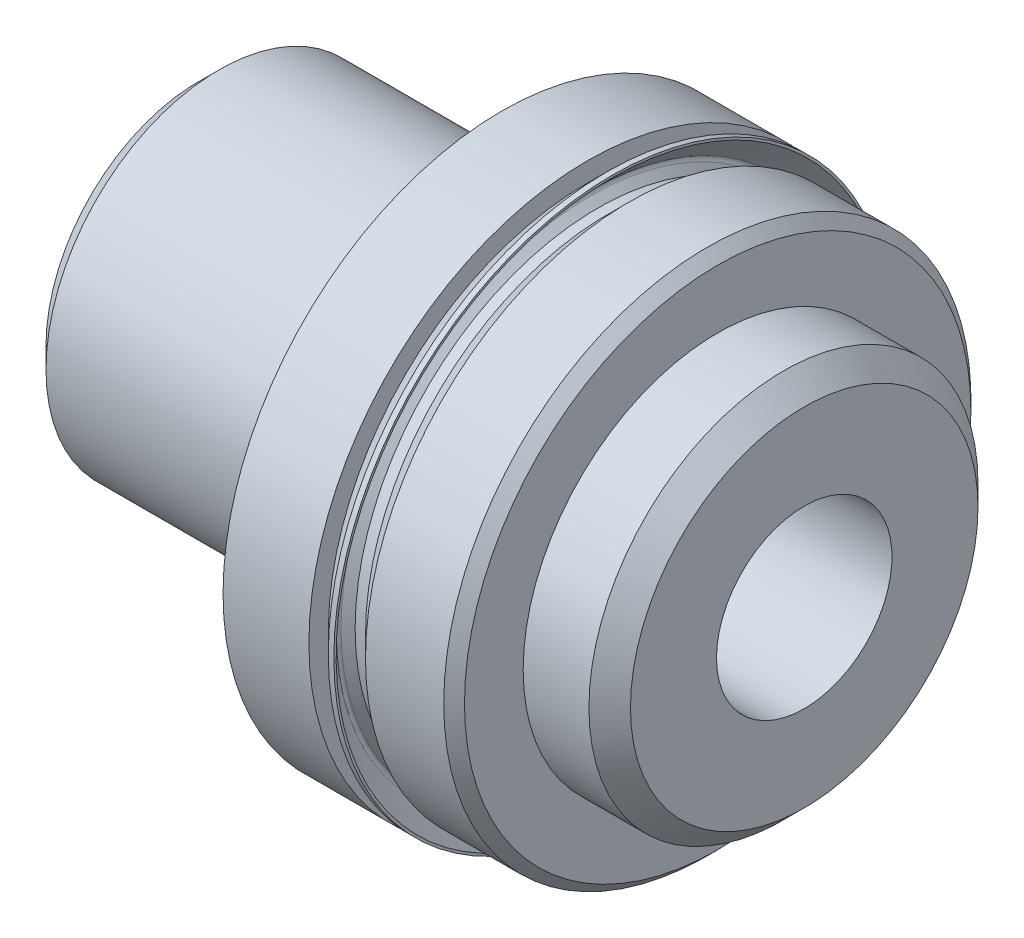
ISO-10303-21;
HEADER;
FILE_DESCRIPTION(('STEP AP214'),'2;1');
FILE_NAME('part.step','',(''),(''),'','','');
FILE_SCHEMA(('AUTOMOTIVE_DESIGN { 1 0 10303 214 1 1 1 1 }'));
ENDSEC;
DATA;
#1=APPLICATION_CONTEXT('core data for automotive mechanical design processes');
#2=APPLICATION_PROTOCOL_DEFINITION('international standard','automotive_design',2000,#1);
#3=PRODUCT_CONTEXT('',#1,'mechanical');
#4=PRODUCT('Part','Part','',(#3));
#5=PRODUCT_RELATED_PRODUCT_CATEGORY('part','',(#4));
#6=PRODUCT_DEFINITION_FORMATION('','',#4);
#7=PRODUCT_DEFINITION_CONTEXT('part definition',#1,'design');
#8=PRODUCT_DEFINITION('design','',#6,#7);
#9=PRODUCT_DEFINITION_SHAPE('','',#8);
#10=(LENGTH_UNIT() NAMED_UNIT(*) SI_UNIT(.MILLI.,.METRE.));
#11=(NAMED_UNIT(*) PLANE_ANGLE_UNIT() SI_UNIT($,.RADIAN.));
#12=(NAMED_UNIT(*) SI_UNIT($,.STERADIAN.) SOLID_ANGLE_UNIT());
#13=UNCERTAINTY_MEASURE_WITH_UNIT(LENGTH_MEASURE(1.E-05),#10,'distance_accuracy_value','');
#14=(GEOMETRIC_REPRESENTATION_CONTEXT(3) GLOBAL_UNCERTAINTY_ASSIGNED_CONTEXT((#13)) GLOBAL_UNIT_ASSIGNED_CONTEXT((#10,
#11,#12)) REPRESENTATION_CONTEXT('',''));
#15=CARTESIAN_POINT('',(0.,0.,0.));
#16=DIRECTION('',(0.,0.,1.));
#17=DIRECTION('',(1.,0.,0.));
#18=AXIS2_PLACEMENT_3D('',#15,#16,#17);
#19=CARTESIAN_POINT('',(15.1894510695975,0.,0.));
#20=DIRECTION('',(1.,0.,0.));
#21=DIRECTION('',(0.,1.,0.));
#22=AXIS2_PLACEMENT_3D('',#19,#20,#21);
#23=CONICAL_SURFACE('',#22,10.1393318041258,0.785398163397446);
#24=CARTESIAN_POINT('',(14.3972871939465,0.,0.));
#25=DIRECTION('',(1.,0.,0.));
#26=DIRECTION('',(0.,0.,-1.));
#27=AXIS2_PLACEMENT_3D('',#24,#25,#26);
#28=CIRCLE('',#27,9.34716792847483);
#29=CARTESIAN_POINT('',(14.3972871939465,0.,-9.34716792847483));
#30=VERTEX_POINT('',#29);
#31=EDGE_CURVE('E80',#30,#30,#28,.F.);
#32=ORIENTED_EDGE('',*,*,#31,.T.);
#33=EDGE_LOOP('',(#32));
#34=FACE_BOUND('',#33,.T.);
#35=CARTESIAN_POINT('',(15.1894510695975,0.,0.));
#36=DIRECTION('',(1.,0.,0.));
#37=DIRECTION('',(0.,1.,0.));
#38=AXIS2_PLACEMENT_3D('',#35,#36,#37);
#39=CIRCLE('',#38,10.1393318041258);
#40=CARTESIAN_POINT('',(15.1894510695975,10.1393318041258,0.));
#41=VERTEX_POINT('',#40);
#42=EDGE_CURVE('E18',#41,#41,#39,.F.);
#43=ORIENTED_EDGE('',*,*,#42,.F.);
#44=EDGE_LOOP('',(#43));
#45=FACE_BOUND('',#44,.T.);
#46=ADVANCED_FACE('F15',(#34,#45),#23,.F.);
#47=CARTESIAN_POINT('',(14.4870897551572,0.,0.));
#48=DIRECTION('',(1.,0.,0.));
#49=DIRECTION('',(0.,0.,-1.));
#50=AXIS2_PLACEMENT_3D('',#47,#48,#49);
#51=TOROIDAL_SURFACE('',#50,9.25736536726414,0.126999999999995);
#52=ORIENTED_EDGE('',*,*,#31,.F.);
#53=EDGE_LOOP('',(#52));
#54=FACE_BOUND('',#53,.T.);
#55=CARTESIAN_POINT('',(14.3972871939465,0.,0.));
#56=DIRECTION('',(-1.,0.,0.));
#57=DIRECTION('',(0.,0.,1.));
#58=AXIS2_PLACEMENT_3D('',#55,#56,#57);
#59=CIRCLE('',#58,9.16756280605345);
#60=CARTESIAN_POINT('',(14.3972871939465,0.,9.16756280605345));
#61=VERTEX_POINT('',#60);
#62=EDGE_CURVE('E73',#61,#61,#59,.F.);
#63=ORIENTED_EDGE('',*,*,#62,.F.);
#64=EDGE_LOOP('',(#63));
#65=FACE_BOUND('',#64,.T.);
#66=ADVANCED_FACE('F82',(#54,#65),#51,.F.);
#67=CARTESIAN_POINT('',(15.1894510695975,10.1393318041258,0.));
#68=DIRECTION('',(1.,0.,0.));
#69=DIRECTION('',(0.,0.,-1.));
#70=AXIS2_PLACEMENT_3D('',#67,#68,#69);
#71=PLANE('',#70);
#72=ORIENTED_EDGE('',*,*,#42,.T.);
#73=EDGE_LOOP('',(#72));
#74=FACE_BOUND('',#73,.T.);
#75=CARTESIAN_POINT('',(15.1894510695975,0.,0.));
#76=DIRECTION('',(-1.,0.,0.));
#77=DIRECTION('',(0.,0.,1.));
#78=AXIS2_PLACEMENT_3D('',#75,#76,#77);
#79=CIRCLE('',#78,10.2235);
#80=CARTESIAN_POINT('',(15.1894510695975,0.,10.2235));
#81=VERTEX_POINT('',#80);
#82=EDGE_CURVE('E70',#81,#81,#79,.T.);
#83=ORIENTED_EDGE('',*,*,#82,.F.);
#84=EDGE_LOOP('',(#83));
#85=FACE_BOUND('',#84,.T.);
#86=ADVANCED_FACE('F85',(#74,#85),#71,.T.);
#87=CARTESIAN_POINT('',(14.3972871939465,0.,0.));
#88=DIRECTION('',(-1.,0.,0.));
#89=DIRECTION('',(0.,-1.,0.));
#90=AXIS2_PLACEMENT_3D('',#87,#88,#89);
#91=CONICAL_SURFACE('',#90,9.16756280605345,0.785398163397438);
#92=CARTESIAN_POINT('',(14.6558,0.,0.));
#93=DIRECTION('',(-1.,0.,0.));
#94=DIRECTION('',(0.,0.,1.));
#95=AXIS2_PLACEMENT_3D('',#92,#93,#94);
#96=CIRCLE('',#95,8.90905);
#97=CARTESIAN_POINT('',(14.6558,0.,8.90905));
#98=VERTEX_POINT('',#97);
#99=EDGE_CURVE('E65',#98,#98,#96,.F.);
#100=ORIENTED_EDGE('',*,*,#99,.F.);
#101=EDGE_LOOP('',(#100));
#102=FACE_BOUND('',#101,.T.);
#103=ORIENTED_EDGE('',*,*,#62,.T.);
#104=EDGE_LOOP('',(#103));
#105=FACE_BOUND('',#104,.T.);
#106=ADVANCED_FACE('F89',(#102,#105),#91,.T.);
#107=CARTESIAN_POINT('',(15.0368,0.,0.));
#108=DIRECTION('',(-1.,0.,0.));
#109=DIRECTION('',(0.,0.,1.));
#110=AXIS2_PLACEMENT_3D('',#107,#108,#109);
#111=CYLINDRICAL_SURFACE('',#110,10.2235);
#112=ORIENTED_EDGE('',*,*,#82,.T.);
#113=EDGE_LOOP('',(#112));
#114=FACE_BOUND('',#113,.T.);
#115=CARTESIAN_POINT('',(14.9862510695975,0.,0.));
#116=DIRECTION('',(1.,0.,0.));
#117=DIRECTION('',(0.,0.,-1.));
#118=AXIS2_PLACEMENT_3D('',#115,#116,#117);
#119=CIRCLE('',#118,10.2235);
#120=CARTESIAN_POINT('',(14.9862510695975,0.,-10.2235));
#121=VERTEX_POINT('',#120);
#122=EDGE_CURVE('E60',#121,#121,#119,.F.);
#123=ORIENTED_EDGE('',*,*,#122,.F.);
#124=EDGE_LOOP('',(#123));
#125=FACE_BOUND('',#124,.T.);
#126=ADVANCED_FACE('F93',(#114,#125),#111,.T.);
#127=CARTESIAN_POINT('',(19.05,0.,0.));
#128=DIRECTION('',(-1.,0.,0.));
#129=DIRECTION('',(0.,0.,1.));
#130=AXIS2_PLACEMENT_3D('',#127,#128,#129);
#131=CYLINDRICAL_SURFACE('',#130,8.90905);
#132=ORIENTED_EDGE('',*,*,#99,.T.);
#133=EDGE_LOOP('',(#132));
#134=FACE_BOUND('',#133,.T.);
#135=CARTESIAN_POINT('',(15.0368,0.,0.));
#136=DIRECTION('',(1.,0.,0.));
#137=DIRECTION('',(0.,0.,-1.));
#138=AXIS2_PLACEMENT_3D('',#135,#136,#137);
#139=CIRCLE('',#138,8.90905);
#140=CARTESIAN_POINT('',(15.0368,0.,-8.90905));
#141=VERTEX_POINT('',#140);
#142=EDGE_CURVE('E57',#141,#141,#139,.T.);
#143=ORIENTED_EDGE('',*,*,#142,.F.);
#144=EDGE_LOOP('',(#143));
#145=FACE_BOUND('',#144,.T.);
#146=ADVANCED_FACE('F97',(#134,#145),#131,.T.);
#147=CARTESIAN_POINT('',(14.9862510695975,0.,0.));
#148=DIRECTION('',(1.,0.,0.));
#149=DIRECTION('',(0.,1.,0.));
#150=AXIS2_PLACEMENT_3D('',#147,#148,#149);
#151=CONICAL_SURFACE('',#150,10.2235,0.785398163397447);
#152=ORIENTED_EDGE('',*,*,#122,.T.);
#153=EDGE_LOOP('',(#152));
#154=FACE_BOUND('',#153,.T.);
#155=CARTESIAN_POINT('',(14.2748,0.,0.));
#156=DIRECTION('',(1.,0.,0.));
#157=DIRECTION('',(0.,1.,0.));
#158=AXIS2_PLACEMENT_3D('',#155,#156,#157);
#159=CIRCLE('',#158,9.51204893040252);
#160=CARTESIAN_POINT('',(14.2748,9.51204893040252,0.));
#161=VERTEX_POINT('',#160);
#162=EDGE_CURVE('E54',#161,#161,#159,.T.);
#163=ORIENTED_EDGE('',*,*,#162,.T.);
#164=EDGE_LOOP('',(#163));
#165=FACE_BOUND('',#164,.T.);
#166=ADVANCED_FACE('F101',(#154,#165),#151,.T.);
#167=CARTESIAN_POINT('',(15.7988,0.,0.));
#168=DIRECTION('',(1.,0.,0.));
#169=DIRECTION('',(0.,0.,-1.));
#170=AXIS2_PLACEMENT_3D('',#167,#168,#169);
#171=CONICAL_SURFACE('',#170,9.67105,0.785398163397447);
#172=ORIENTED_EDGE('',*,*,#142,.T.);
#173=EDGE_LOOP('',(#172));
#174=FACE_BOUND('',#173,.T.);
#175=CARTESIAN_POINT('',(15.7988,0.,0.));
#176=DIRECTION('',(-1.,0.,0.));
#177=DIRECTION('',(0.,0.,1.));
#178=AXIS2_PLACEMENT_3D('',#175,#176,#177);
#179=CIRCLE('',#178,9.67105);
#180=CARTESIAN_POINT('',(15.7988,0.,9.67105));
#181=VERTEX_POINT('',#180);
#182=EDGE_CURVE('E51',#181,#181,#179,.F.);
#183=ORIENTED_EDGE('',*,*,#182,.F.);
#184=EDGE_LOOP('',(#183));
#185=FACE_BOUND('',#184,.T.);
#186=ADVANCED_FACE('F105',(#174,#185),#171,.T.);
#187=CARTESIAN_POINT('',(14.2748,10.2235,0.));
#188=DIRECTION('',(-1.,0.,0.));
#189=DIRECTION('',(0.,0.,1.));
#190=AXIS2_PLACEMENT_3D('',#187,#188,#189);
#191=PLANE('',#190);
#192=CARTESIAN_POINT('',(14.2748,0.,0.));
#193=DIRECTION('',(-1.,0.,0.));
#194=DIRECTION('',(0.,0.,1.));
#195=AXIS2_PLACEMENT_3D('',#192,#193,#194);
#196=CIRCLE('',#195,10.2235);
#197=CARTESIAN_POINT('',(14.2748,0.,10.2235));
#198=VERTEX_POINT('',#197);
#199=EDGE_CURVE('E48',#198,#198,#196,.T.);
#200=ORIENTED_EDGE('',*,*,#199,.F.);
#201=EDGE_LOOP('',(#200));
#202=FACE_BOUND('',#201,.T.);
#203=ORIENTED_EDGE('',*,*,#162,.F.);
#204=EDGE_LOOP('',(#203));
#205=FACE_BOUND('',#204,.T.);
#206=ADVANCED_FACE('F109',(#202,#205),#191,.F.);
#207=CARTESIAN_POINT('',(19.05,0.,0.));
#208=DIRECTION('',(-1.,0.,0.));
#209=DIRECTION('',(0.,0.,1.));
#210=AXIS2_PLACEMENT_3D('',#207,#208,#209);
#211=CYLINDRICAL_SURFACE('',#210,9.67105);
#212=ORIENTED_EDGE('',*,*,#182,.T.);
#213=EDGE_LOOP('',(#212));
#214=FACE_BOUND('',#213,.T.);
#215=CARTESIAN_POINT('',(18.669,0.,0.));
#216=DIRECTION('',(-1.,0.,0.));
#217=DIRECTION('',(0.,0.,1.));
#218=AXIS2_PLACEMENT_3D('',#215,#216,#217);
#219=CIRCLE('',#218,9.67105);
#220=CARTESIAN_POINT('',(18.669,0.,9.67105));
#221=VERTEX_POINT('',#220);
#222=EDGE_CURVE('E44',#221,#221,#219,.F.);
#223=ORIENTED_EDGE('',*,*,#222,.F.);
#224=EDGE_LOOP('',(#223));
#225=FACE_BOUND('',#224,.T.);
#226=ADVANCED_FACE('F113',(#214,#225),#211,.T.);
#227=CARTESIAN_POINT('',(19.05,0.,0.));
#228=DIRECTION('',(-1.,0.,0.));
#229=DIRECTION('',(0.,0.,1.));
#230=AXIS2_PLACEMENT_3D('',#227,#228,#229);
#231=CYLINDRICAL_SURFACE('',#230,10.2235);
#232=CARTESIAN_POINT('',(11.1252,0.,0.));
#233=DIRECTION('',(-1.,0.,0.));
#234=DIRECTION('',(0.,0.,1.));
#235=AXIS2_PLACEMENT_3D('',#232,#233,#234);
#236=CIRCLE('',#235,10.2235);
#237=CARTESIAN_POINT('',(11.1252,0.,10.2235));
#238=VERTEX_POINT('',#237);
#239=EDGE_CURVE('E47',#238,#238,#236,.F.);
#240=ORIENTED_EDGE('',*,*,#239,.T.);
#241=EDGE_LOOP('',(#240));
#242=FACE_BOUND('',#241,.T.);
#243=ORIENTED_EDGE('',*,*,#199,.T.);
#244=EDGE_LOOP('',(#243));
#245=FACE_BOUND('',#244,.T.);
#246=ADVANCED_FACE('F117',(#242,#245),#231,.T.);
#247=CARTESIAN_POINT('',(18.669,0.,0.));
#248=DIRECTION('',(-1.,0.,0.));
#249=DIRECTION('',(0.,0.,1.));
#250=AXIS2_PLACEMENT_3D('',#247,#248,#249);
#251=CONICAL_SURFACE('',#250,9.67105,0.785398163397448);
#252=ORIENTED_EDGE('',*,*,#222,.T.);
#253=EDGE_LOOP('',(#252));
#254=FACE_BOUND('',#253,.T.);
#255=CARTESIAN_POINT('',(19.05,0.,0.));
#256=DIRECTION('',(-1.,0.,0.));
#257=DIRECTION('',(0.,0.,1.));
#258=AXIS2_PLACEMENT_3D('',#255,#256,#257);
#259=CIRCLE('',#258,9.29005);
#260=CARTESIAN_POINT('',(19.05,0.,9.29005));
#261=VERTEX_POINT('',#260);
#262=EDGE_CURVE('E325',#261,#261,#259,.T.);
#263=ORIENTED_EDGE('',*,*,#262,.T.);
#264=EDGE_LOOP('',(#263));
#265=FACE_BOUND('',#264,.T.);
#266=ADVANCED_FACE('F121',(#254,#265),#251,.T.);
#267=CARTESIAN_POINT('',(11.1252,0.,0.));
#268=DIRECTION('',(1.,0.,0.));
#269=DIRECTION('',(0.,0.,-1.));
#270=AXIS2_PLACEMENT_3D('',#267,#268,#269);
#271=PLANE('',#270);
#272=CARTESIAN_POINT('',(11.1252,0.,0.));
#273=DIRECTION('',(-1.,0.,0.));
#274=DIRECTION('',(0.,0.,1.));
#275=AXIS2_PLACEMENT_3D('',#272,#273,#274);
#276=CIRCLE('',#275,6.35);
#277=CARTESIAN_POINT('',(11.1252,0.,6.35));
#278=VERTEX_POINT('',#277);
#279=EDGE_CURVE('E328',#278,#278,#276,.T.);
#280=ORIENTED_EDGE('',*,*,#279,.F.);
#281=EDGE_LOOP('',(#280));
#282=FACE_BOUND('',#281,.T.);
#283=ORIENTED_EDGE('',*,*,#239,.F.);
#284=EDGE_LOOP('',(#283));
#285=FACE_BOUND('',#284,.T.);
#286=ADVANCED_FACE('F125',(#282,#285),#271,.F.);
#287=CARTESIAN_POINT('',(19.05,9.29005,0.));
#288=DIRECTION('',(-1.,0.,0.));
#289=DIRECTION('',(0.,0.,1.));
#290=AXIS2_PLACEMENT_3D('',#287,#288,#289);
#291=PLANE('',#290);
#292=ORIENTED_EDGE('',*,*,#262,.F.);
#293=EDGE_LOOP('',(#292));
#294=FACE_BOUND('',#293,.T.);
#295=CARTESIAN_POINT('',(19.05,0.,0.));
#296=DIRECTION('',(-1.,0.,0.));
#297=DIRECTION('',(0.,0.,1.));
#298=AXIS2_PLACEMENT_3D('',#295,#296,#297);
#299=CIRCLE('',#298,7.1374);
#300=CARTESIAN_POINT('',(19.05,0.,7.1374));
#301=VERTEX_POINT('',#300);
#302=EDGE_CURVE('E41',#301,#301,#299,.F.);
#303=ORIENTED_EDGE('',*,*,#302,.F.);
#304=EDGE_LOOP('',(#303));
#305=FACE_BOUND('',#304,.T.);
#306=ADVANCED_FACE('F129',(#294,#305),#291,.F.);
#307=CARTESIAN_POINT('',(11.1252,0.,0.));
#308=DIRECTION('',(-1.,0.,0.));
#309=DIRECTION('',(0.,0.,1.));
#310=AXIS2_PLACEMENT_3D('',#307,#308,#309);
#311=CYLINDRICAL_SURFACE('',#310,6.35);
#312=CARTESIAN_POINT('',(0.755649999973684,0.,0.));
#313=DIRECTION('',(1.,0.,0.));
#314=DIRECTION('',(0.,0.,-1.));
#315=AXIS2_PLACEMENT_3D('',#312,#313,#314);
#316=CIRCLE('',#315,6.35000000005448);
#317=CARTESIAN_POINT('',(0.755649999973684,0.,-6.35000000005448));
#318=VERTEX_POINT('',#317);
#319=EDGE_CURVE('E36',#318,#318,#316,.F.);
#320=ORIENTED_EDGE('',*,*,#319,.F.);
#321=EDGE_LOOP('',(#320));
#322=FACE_BOUND('',#321,.T.);
#323=ORIENTED_EDGE('',*,*,#279,.T.);
#324=EDGE_LOOP('',(#323));
#325=FACE_BOUND('',#324,.T.);
#326=ADVANCED_FACE('F133',(#322,#325),#311,.T.);
#327=CARTESIAN_POINT('',(22.225,0.,0.));
#328=DIRECTION('',(-1.,0.,0.));
#329=DIRECTION('',(0.,0.,1.));
#330=AXIS2_PLACEMENT_3D('',#327,#328,#329);
#331=CYLINDRICAL_SURFACE('',#330,7.1374);
#332=ORIENTED_EDGE('',*,*,#302,.T.);
#333=EDGE_LOOP('',(#332));
#334=FACE_BOUND('',#333,.T.);
#335=CARTESIAN_POINT('',(21.463,0.,0.));
#336=DIRECTION('',(-1.,0.,0.));
#337=DIRECTION('',(0.,0.,1.));
#338=AXIS2_PLACEMENT_3D('',#335,#336,#337);
#339=CIRCLE('',#338,7.1374);
#340=CARTESIAN_POINT('',(21.463,0.,7.1374));
#341=VERTEX_POINT('',#340);
#342=EDGE_CURVE('E32',#341,#341,#339,.F.);
#343=ORIENTED_EDGE('',*,*,#342,.F.);
#344=EDGE_LOOP('',(#343));
#345=FACE_BOUND('',#344,.T.);
#346=ADVANCED_FACE('F137',(#334,#345),#331,.T.);
#347=CARTESIAN_POINT('',(0.755649999973684,0.,0.));
#348=DIRECTION('',(1.,0.,0.));
#349=DIRECTION('',(0.,0.,-1.));
#350=AXIS2_PLACEMENT_3D('',#347,#348,#349);
#351=CONICAL_SURFACE('',#350,6.35000000005448,0.785398163397448);
#352=CARTESIAN_POINT('',(-5.6843418860808E-11,0.,0.));
#353=DIRECTION('',(1.,0.,0.));
#354=DIRECTION('',(0.,0.,-1.));
#355=AXIS2_PLACEMENT_3D('',#352,#353,#354);
#356=CIRCLE('',#355,5.59435000002395);
#357=CARTESIAN_POINT('',(-5.6843418860808E-11,0.,-5.59435000002395));
#358=VERTEX_POINT('',#357);
#359=EDGE_CURVE('E35',#358,#358,#356,.T.);
#360=ORIENTED_EDGE('',*,*,#359,.T.);
#361=EDGE_LOOP('',(#360));
#362=FACE_BOUND('',#361,.T.);
#363=ORIENTED_EDGE('',*,*,#319,.T.);
#364=EDGE_LOOP('',(#363));
#365=FACE_BOUND('',#364,.T.);
#366=ADVANCED_FACE('F141',(#362,#365),#351,.T.);
#367=CARTESIAN_POINT('',(21.463,0.,0.));
#368=DIRECTION('',(-1.,0.,0.));
#369=DIRECTION('',(0.,0.,1.));
#370=AXIS2_PLACEMENT_3D('',#367,#368,#369);
#371=CONICAL_SURFACE('',#370,7.1374,0.78539816339745);
#372=ORIENTED_EDGE('',*,*,#342,.T.);
#373=EDGE_LOOP('',(#372));
#374=FACE_BOUND('',#373,.T.);
#375=CARTESIAN_POINT('',(22.225,0.,0.));
#376=DIRECTION('',(-1.,0.,0.));
#377=DIRECTION('',(0.,0.,1.));
#378=AXIS2_PLACEMENT_3D('',#375,#376,#377);
#379=CIRCLE('',#378,6.3754);
#380=CARTESIAN_POINT('',(22.225,0.,6.3754));
#381=VERTEX_POINT('',#380);
#382=EDGE_CURVE('E335',#381,#381,#379,.T.);
#383=ORIENTED_EDGE('',*,*,#382,.T.);
#384=EDGE_LOOP('',(#383));
#385=FACE_BOUND('',#384,.T.);
#386=ADVANCED_FACE('F145',(#374,#385),#371,.T.);
#387=CARTESIAN_POINT('',(0.,0.,0.));
#388=DIRECTION('',(1.,0.,0.));
#389=DIRECTION('',(0.,0.,-1.));
#390=AXIS2_PLACEMENT_3D('',#387,#388,#389);
#391=PLANE('',#390);
#392=CARTESIAN_POINT('',(5.6843418860808E-11,0.,0.));
#393=DIRECTION('',(-1.,0.,0.));
#394=DIRECTION('',(0.,0.,1.));
#395=AXIS2_PLACEMENT_3D('',#392,#393,#394);
#396=CIRCLE('',#395,3.47345000000132);
#397=CARTESIAN_POINT('',(5.6843418860808E-11,0.,3.47345000000132));
#398=VERTEX_POINT('',#397);
#399=EDGE_CURVE('E27',#398,#398,#396,.F.);
#400=ORIENTED_EDGE('',*,*,#399,.T.);
#401=EDGE_LOOP('',(#400));
#402=FACE_BOUND('',#401,.T.);
#403=ORIENTED_EDGE('',*,*,#359,.F.);
#404=EDGE_LOOP('',(#403));
#405=FACE_BOUND('',#404,.T.);
#406=ADVANCED_FACE('F149',(#402,#405),#391,.F.);
#407=CARTESIAN_POINT('',(22.225,6.3754,0.));
#408=DIRECTION('',(-1.,0.,0.));
#409=DIRECTION('',(0.,0.,1.));
#410=AXIS2_PLACEMENT_3D('',#407,#408,#409);
#411=PLANE('',#410);
#412=ORIENTED_EDGE('',*,*,#382,.F.);
#413=EDGE_LOOP('',(#412));
#414=FACE_BOUND('',#413,.T.);
#415=CARTESIAN_POINT('',(22.225,0.,0.));
#416=DIRECTION('',(-1.,0.,0.));
#417=DIRECTION('',(0.,0.,1.));
#418=AXIS2_PLACEMENT_3D('',#415,#416,#417);
#419=CIRCLE('',#418,3.21945);
#420=CARTESIAN_POINT('',(22.225,0.,3.21945));
#421=VERTEX_POINT('',#420);
#422=EDGE_CURVE('E22',#421,#421,#419,.T.);
#423=ORIENTED_EDGE('',*,*,#422,.T.);
#424=EDGE_LOOP('',(#423));
#425=FACE_BOUND('',#424,.T.);
#426=ADVANCED_FACE('F153',(#414,#425),#411,.F.);
#427=CARTESIAN_POINT('',(1.13686837721616E-10,0.,0.));
#428=DIRECTION('',(-1.,0.,0.));
#429=DIRECTION('',(0.,0.,1.));
#430=AXIS2_PLACEMENT_3D('',#427,#428,#429);
#431=CONICAL_SURFACE('',#430,3.47344999994448,0.785398163397448);
#432=ORIENTED_EDGE('',*,*,#399,.F.);
#433=EDGE_LOOP('',(#432));
#434=FACE_BOUND('',#433,.T.);
#435=CARTESIAN_POINT('',(0.253999999999997,0.,0.));
#436=DIRECTION('',(-1.,0.,0.));
#437=DIRECTION('',(0.,0.,1.));
#438=AXIS2_PLACEMENT_3D('',#435,#436,#437);
#439=CIRCLE('',#438,3.21945);
#440=CARTESIAN_POINT('',(0.253999999999997,0.,3.21945));
#441=VERTEX_POINT('',#440);
#442=EDGE_CURVE('E10',#441,#441,#439,.F.);
#443=ORIENTED_EDGE('',*,*,#442,.T.);
#444=EDGE_LOOP('',(#443));
#445=FACE_BOUND('',#444,.T.);
#446=ADVANCED_FACE('F157',(#434,#445),#431,.F.);
#447=CARTESIAN_POINT('',(22.225,0.,0.));
#448=DIRECTION('',(-1.,0.,0.));
#449=DIRECTION('',(0.,0.,1.));
#450=AXIS2_PLACEMENT_3D('',#447,#448,#449);
#451=CYLINDRICAL_SURFACE('',#450,3.21945);
#452=ORIENTED_EDGE('',*,*,#442,.F.);
#453=EDGE_LOOP('',(#452));
#454=FACE_BOUND('',#453,.T.);
#455=ORIENTED_EDGE('',*,*,#422,.F.);
#456=EDGE_LOOP('',(#455));
#457=FACE_BOUND('',#456,.T.);
#458=ADVANCED_FACE('F161',(#454,#457),#451,.F.);
#459=CLOSED_SHELL('',(#46,#66,#86,#106,#126,#146,#166,#186,#206,#226,#246,#266,#286,#306,#326,
#346,#366,#386,#406,#426,#446,#458));
#460=MANIFOLD_SOLID_BREP('B1',#459);
#461=ADVANCED_BREP_SHAPE_REPRESENTATION('',(#18,#460),#14);
#462=SHAPE_DEFINITION_REPRESENTATION(#9,#461);
ENDSEC;
END-ISO-10303-21;
